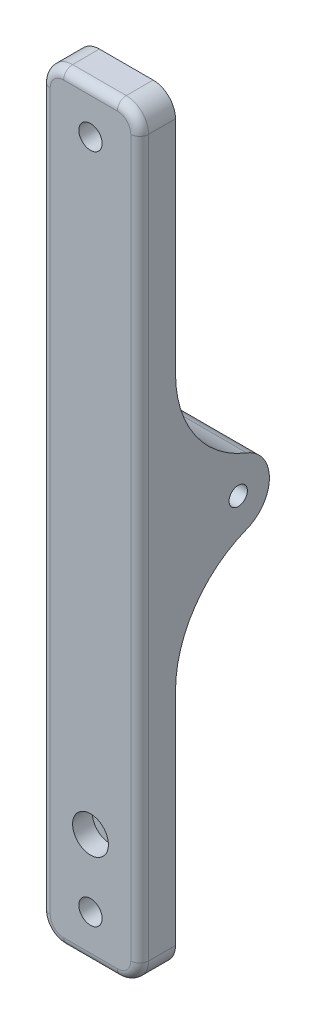
ISO-10303-21;
HEADER;
FILE_DESCRIPTION(('STEP AP214'),'2;1');
FILE_NAME('part.step','',(''),(''),'','','');
FILE_SCHEMA(('AUTOMOTIVE_DESIGN { 1 0 10303 214 1 1 1 1 }'));
ENDSEC;
DATA;
#1=APPLICATION_CONTEXT('core data for automotive mechanical design processes');
#2=APPLICATION_PROTOCOL_DEFINITION('international standard','automotive_design',2000,#1);
#3=PRODUCT_CONTEXT('',#1,'mechanical');
#4=PRODUCT('Part','Part','',(#3));
#5=PRODUCT_RELATED_PRODUCT_CATEGORY('part','',(#4));
#6=PRODUCT_DEFINITION_FORMATION('','',#4);
#7=PRODUCT_DEFINITION_CONTEXT('part definition',#1,'design');
#8=PRODUCT_DEFINITION('design','',#6,#7);
#9=PRODUCT_DEFINITION_SHAPE('','',#8);
#10=(LENGTH_UNIT() NAMED_UNIT(*) SI_UNIT(.MILLI.,.METRE.));
#11=(NAMED_UNIT(*) PLANE_ANGLE_UNIT() SI_UNIT($,.RADIAN.));
#12=(NAMED_UNIT(*) SI_UNIT($,.STERADIAN.) SOLID_ANGLE_UNIT());
#13=UNCERTAINTY_MEASURE_WITH_UNIT(LENGTH_MEASURE(1.E-05),#10,'distance_accuracy_value','');
#14=(GEOMETRIC_REPRESENTATION_CONTEXT(3) GLOBAL_UNCERTAINTY_ASSIGNED_CONTEXT((#13)) GLOBAL_UNIT_ASSIGNED_CONTEXT((#10,
#11,#12)) REPRESENTATION_CONTEXT('',''));
#15=CARTESIAN_POINT('',(0.,0.,0.));
#16=DIRECTION('',(0.,0.,1.));
#17=DIRECTION('',(1.,0.,0.));
#18=AXIS2_PLACEMENT_3D('',#15,#16,#17);
#19=CARTESIAN_POINT('',(11.,-85.,14.5));
#20=DIRECTION('',(-1.,0.,0.));
#21=DIRECTION('',(0.,0.,1.));
#22=AXIS2_PLACEMENT_3D('',#19,#20,#21);
#23=PLANE('',#22);
#24=CARTESIAN_POINT('',(11.,0.,-7.51700000000001));
#25=DIRECTION('',(1.,0.,0.));
#26=DIRECTION('',(0.,0.,-1.));
#27=AXIS2_PLACEMENT_3D('',#24,#25,#26);
#28=CIRCLE('',#27,2.05);
#29=CARTESIAN_POINT('',(11.,0.,-9.56700000000001));
#30=VERTEX_POINT('',#29);
#31=EDGE_CURVE('E665',#30,#30,#28,.T.);
#32=ORIENTED_EDGE('',*,*,#31,.F.);
#33=EDGE_LOOP('',(#32));
#34=FACE_BOUND('',#33,.T.);
#35=CARTESIAN_POINT('',(11.,-30.6779253585061,-18.5));
#36=DIRECTION('',(-1.,0.,0.));
#37=DIRECTION('',(0.,0.,1.));
#38=AXIS2_PLACEMENT_3D('',#35,#36,#37);
#39=CIRCLE('',#38,25.);
#40=CARTESIAN_POINT('',(11.,-30.6779253585062,6.49999999999999));
#41=VERTEX_POINT('',#40);
#42=CARTESIAN_POINT('',(11.,-7.38940089041614,-9.40909090909091));
#43=VERTEX_POINT('',#42);
#44=EDGE_CURVE('E160',#41,#43,#39,.T.);
#45=ORIENTED_EDGE('',*,*,#44,.T.);
#46=CARTESIAN_POINT('',(11.,0.0629269393726574,-6.5));
#47=DIRECTION('',(-1.,0.,0.));
#48=DIRECTION('',(0.,0.,1.));
#49=AXIS2_PLACEMENT_3D('',#46,#47,#48);
#50=CIRCLE('',#49,8.);
#51=CARTESIAN_POINT('',(11.,0.,-14.4997525086906));
#52=VERTEX_POINT('',#51);
#53=EDGE_CURVE('E283',#43,#52,#50,.F.);
#54=ORIENTED_EDGE('',*,*,#53,.T.);
#55=CARTESIAN_POINT('',(11.,-0.0629269393726574,-6.5));
#56=DIRECTION('',(-1.,0.,0.));
#57=DIRECTION('',(0.,0.,1.));
#58=AXIS2_PLACEMENT_3D('',#55,#56,#57);
#59=CIRCLE('',#58,8.);
#60=CARTESIAN_POINT('',(11.,7.38940089041614,-9.40909090909091));
#61=VERTEX_POINT('',#60);
#62=EDGE_CURVE('E281',#52,#61,#59,.F.);
#63=ORIENTED_EDGE('',*,*,#62,.T.);
#64=CARTESIAN_POINT('',(11.,30.6779253585061,-18.5));
#65=DIRECTION('',(-1.,0.,0.));
#66=DIRECTION('',(0.,0.,1.));
#67=AXIS2_PLACEMENT_3D('',#64,#65,#66);
#68=CIRCLE('',#67,25.);
#69=CARTESIAN_POINT('',(11.,30.6779253585062,6.49999999999999));
#70=VERTEX_POINT('',#69);
#71=EDGE_CURVE('E193',#61,#70,#68,.T.);
#72=ORIENTED_EDGE('',*,*,#71,.T.);
#73=DIRECTION('',(0.,-1.,0.));
#74=VECTOR('',#73,1.);
#75=CARTESIAN_POINT('',(11.,85.,6.5));
#76=LINE('',#75,#74);
#77=CARTESIAN_POINT('',(11.,80.,6.5));
#78=VERTEX_POINT('',#77);
#79=EDGE_CURVE('E304',#78,#70,#76,.T.);
#80=ORIENTED_EDGE('',*,*,#79,.F.);
#81=DIRECTION('',(0.,0.,-1.));
#82=VECTOR('',#81,1.);
#83=CARTESIAN_POINT('',(11.,80.,14.5));
#84=LINE('',#83,#82);
#85=CARTESIAN_POINT('',(11.,80.,12.5));
#86=VERTEX_POINT('',#85);
#87=EDGE_CURVE('E197',#78,#86,#84,.F.);
#88=ORIENTED_EDGE('',*,*,#87,.T.);
#89=DIRECTION('',(0.,1.,0.));
#90=VECTOR('',#89,1.);
#91=CARTESIAN_POINT('',(11.,-85.,12.5));
#92=LINE('',#91,#90);
#93=CARTESIAN_POINT('',(11.,-80.,12.5));
#94=VERTEX_POINT('',#93);
#95=EDGE_CURVE('E252',#86,#94,#92,.F.);
#96=ORIENTED_EDGE('',*,*,#95,.T.);
#97=DIRECTION('',(0.,0.,-1.));
#98=VECTOR('',#97,1.);
#99=CARTESIAN_POINT('',(11.,-80.,14.5));
#100=LINE('',#99,#98);
#101=CARTESIAN_POINT('',(11.,-80.,6.5));
#102=VERTEX_POINT('',#101);
#103=EDGE_CURVE('E162',#94,#102,#100,.T.);
#104=ORIENTED_EDGE('',*,*,#103,.T.);
#105=DIRECTION('',(0.,1.,0.));
#106=VECTOR('',#105,1.);
#107=CARTESIAN_POINT('',(11.,-85.,6.5));
#108=LINE('',#107,#106);
#109=EDGE_CURVE('E158',#102,#41,#108,.T.);
#110=ORIENTED_EDGE('',*,*,#109,.T.);
#111=EDGE_LOOP('',(#45,#54,#63,#72,#80,#88,#96,#104,#110));
#112=FACE_BOUND('',#111,.T.);
#113=ADVANCED_FACE('F37',(#34,#112),#23,.F.);
#114=CARTESIAN_POINT('',(-11.,-85.,14.5));
#115=DIRECTION('',(1.,0.,0.));
#116=DIRECTION('',(0.,0.,-1.));
#117=AXIS2_PLACEMENT_3D('',#114,#115,#116);
#118=PLANE('',#117);
#119=CARTESIAN_POINT('',(-11.,0.,-7.51700000000001));
#120=DIRECTION('',(1.,0.,0.));
#121=DIRECTION('',(0.,0.,-1.));
#122=AXIS2_PLACEMENT_3D('',#119,#120,#121);
#123=CIRCLE('',#122,2.05);
#124=CARTESIAN_POINT('',(-11.,0.,-9.56700000000001));
#125=VERTEX_POINT('',#124);
#126=EDGE_CURVE('E664',#125,#125,#123,.T.);
#127=ORIENTED_EDGE('',*,*,#126,.T.);
#128=EDGE_LOOP('',(#127));
#129=FACE_BOUND('',#128,.T.);
#130=CARTESIAN_POINT('',(-11.,-0.0629269393726574,-6.5));
#131=DIRECTION('',(1.,0.,0.));
#132=DIRECTION('',(0.,0.,-1.));
#133=AXIS2_PLACEMENT_3D('',#130,#131,#132);
#134=CIRCLE('',#133,8.);
#135=CARTESIAN_POINT('',(-11.,7.38940089041614,-9.40909090909091));
#136=VERTEX_POINT('',#135);
#137=CARTESIAN_POINT('',(-11.,0.,-14.4997525086906));
#138=VERTEX_POINT('',#137);
#139=EDGE_CURVE('E54',#136,#138,#134,.F.);
#140=ORIENTED_EDGE('',*,*,#139,.T.);
#141=CARTESIAN_POINT('',(-11.,0.0629269393726574,-6.5));
#142=DIRECTION('',(1.,0.,0.));
#143=DIRECTION('',(0.,0.,-1.));
#144=AXIS2_PLACEMENT_3D('',#141,#142,#143);
#145=CIRCLE('',#144,8.);
#146=CARTESIAN_POINT('',(-11.,-7.38940089041614,-9.40909090909091));
#147=VERTEX_POINT('',#146);
#148=EDGE_CURVE('E46',#138,#147,#145,.F.);
#149=ORIENTED_EDGE('',*,*,#148,.T.);
#150=CARTESIAN_POINT('',(-11.,-30.6779253585061,-18.5));
#151=DIRECTION('',(1.,0.,0.));
#152=DIRECTION('',(0.,0.,-1.));
#153=AXIS2_PLACEMENT_3D('',#150,#151,#152);
#154=CIRCLE('',#153,25.);
#155=CARTESIAN_POINT('',(-11.,-30.6779253585062,6.49999999999999));
#156=VERTEX_POINT('',#155);
#157=EDGE_CURVE('E177',#147,#156,#154,.T.);
#158=ORIENTED_EDGE('',*,*,#157,.T.);
#159=DIRECTION('',(0.,1.,0.));
#160=VECTOR('',#159,1.);
#161=CARTESIAN_POINT('',(-11.,-85.,6.5));
#162=LINE('',#161,#160);
#163=CARTESIAN_POINT('',(-11.,-80.,6.5));
#164=VERTEX_POINT('',#163);
#165=EDGE_CURVE('E166',#164,#156,#162,.T.);
#166=ORIENTED_EDGE('',*,*,#165,.F.);
#167=DIRECTION('',(0.,0.,-1.));
#168=VECTOR('',#167,1.);
#169=CARTESIAN_POINT('',(-11.,-80.,14.5));
#170=LINE('',#169,#168);
#171=CARTESIAN_POINT('',(-11.,-80.,12.5));
#172=VERTEX_POINT('',#171);
#173=EDGE_CURVE('E212',#164,#172,#170,.F.);
#174=ORIENTED_EDGE('',*,*,#173,.T.);
#175=DIRECTION('',(0.,-1.,0.));
#176=VECTOR('',#175,1.);
#177=CARTESIAN_POINT('',(-11.,-85.,12.5));
#178=LINE('',#177,#176);
#179=CARTESIAN_POINT('',(-11.,79.9999999999999,12.5));
#180=VERTEX_POINT('',#179);
#181=EDGE_CURVE('E244',#172,#180,#178,.F.);
#182=ORIENTED_EDGE('',*,*,#181,.T.);
#183=DIRECTION('',(0.,0.,-1.));
#184=VECTOR('',#183,1.);
#185=CARTESIAN_POINT('',(-11.,79.9999999999999,14.5));
#186=LINE('',#185,#184);
#187=CARTESIAN_POINT('',(-11.,79.9999999999999,6.5));
#188=VERTEX_POINT('',#187);
#189=EDGE_CURVE('E210',#180,#188,#186,.T.);
#190=ORIENTED_EDGE('',*,*,#189,.T.);
#191=DIRECTION('',(0.,-1.,0.));
#192=VECTOR('',#191,1.);
#193=CARTESIAN_POINT('',(-11.,85.,6.5));
#194=LINE('',#193,#192);
#195=CARTESIAN_POINT('',(-11.,30.6779253585062,6.49999999999999));
#196=VERTEX_POINT('',#195);
#197=EDGE_CURVE('E188',#188,#196,#194,.T.);
#198=ORIENTED_EDGE('',*,*,#197,.T.);
#199=CARTESIAN_POINT('',(-11.,30.6779253585061,-18.5));
#200=DIRECTION('',(1.,0.,0.));
#201=DIRECTION('',(0.,0.,-1.));
#202=AXIS2_PLACEMENT_3D('',#199,#200,#201);
#203=CIRCLE('',#202,25.);
#204=EDGE_CURVE('E195',#196,#136,#203,.T.);
#205=ORIENTED_EDGE('',*,*,#204,.T.);
#206=EDGE_LOOP('',(#140,#149,#158,#166,#174,#182,#190,#198,#205));
#207=FACE_BOUND('',#206,.T.);
#208=ADVANCED_FACE('F314',(#129,#207),#118,.F.);
#209=CARTESIAN_POINT('',(-11.,-85.,14.5));
#210=DIRECTION('',(0.,1.,0.));
#211=DIRECTION('',(0.,0.,1.));
#212=AXIS2_PLACEMENT_3D('',#209,#210,#211);
#213=PLANE('',#212);
#214=DIRECTION('',(0.,0.,-1.));
#215=VECTOR('',#214,1.);
#216=CARTESIAN_POINT('',(6.,-85.,14.5));
#217=LINE('',#216,#215);
#218=CARTESIAN_POINT('',(6.,-85.,6.5));
#219=VERTEX_POINT('',#218);
#220=CARTESIAN_POINT('',(6.,-85.,12.5));
#221=VERTEX_POINT('',#220);
#222=EDGE_CURVE('E207',#219,#221,#217,.F.);
#223=ORIENTED_EDGE('',*,*,#222,.T.);
#224=DIRECTION('',(1.,0.,0.));
#225=VECTOR('',#224,1.);
#226=CARTESIAN_POINT('',(-11.,-85.,12.5));
#227=LINE('',#226,#225);
#228=CARTESIAN_POINT('',(-6.,-85.,12.5));
#229=VERTEX_POINT('',#228);
#230=EDGE_CURVE('E256',#221,#229,#227,.F.);
#231=ORIENTED_EDGE('',*,*,#230,.T.);
#232=DIRECTION('',(0.,0.,-1.));
#233=VECTOR('',#232,1.);
#234=CARTESIAN_POINT('',(-6.,-85.,14.5));
#235=LINE('',#234,#233);
#236=CARTESIAN_POINT('',(-6.,-85.,6.5));
#237=VERTEX_POINT('',#236);
#238=EDGE_CURVE('E205',#229,#237,#235,.T.);
#239=ORIENTED_EDGE('',*,*,#238,.T.);
#240=DIRECTION('',(1.,0.,0.));
#241=VECTOR('',#240,1.);
#242=CARTESIAN_POINT('',(-11.,-85.,6.5));
#243=LINE('',#242,#241);
#244=EDGE_CURVE('E300',#237,#219,#243,.T.);
#245=ORIENTED_EDGE('',*,*,#244,.T.);
#246=EDGE_LOOP('',(#223,#231,#239,#245));
#247=FACE_BOUND('',#246,.T.);
#248=ADVANCED_FACE('F379',(#247),#213,.F.);
#249=CARTESIAN_POINT('',(-11.,85.,14.5));
#250=DIRECTION('',(0.,-1.,0.));
#251=DIRECTION('',(0.,0.,-1.));
#252=AXIS2_PLACEMENT_3D('',#249,#250,#251);
#253=PLANE('',#252);
#254=DIRECTION('',(0.,0.,-1.));
#255=VECTOR('',#254,1.);
#256=CARTESIAN_POINT('',(-6.,85.,14.5));
#257=LINE('',#256,#255);
#258=CARTESIAN_POINT('',(-6.,85.,6.5));
#259=VERTEX_POINT('',#258);
#260=CARTESIAN_POINT('',(-6.,85.,12.5));
#261=VERTEX_POINT('',#260);
#262=EDGE_CURVE('E221',#259,#261,#257,.F.);
#263=ORIENTED_EDGE('',*,*,#262,.T.);
#264=DIRECTION('',(-1.,0.,0.));
#265=VECTOR('',#264,1.);
#266=CARTESIAN_POINT('',(-11.,85.,12.5));
#267=LINE('',#266,#265);
#268=CARTESIAN_POINT('',(5.99999999999999,85.,12.5));
#269=VERTEX_POINT('',#268);
#270=EDGE_CURVE('E248',#261,#269,#267,.F.);
#271=ORIENTED_EDGE('',*,*,#270,.T.);
#272=DIRECTION('',(0.,0.,-1.));
#273=VECTOR('',#272,1.);
#274=CARTESIAN_POINT('',(5.99999999999999,85.,14.5));
#275=LINE('',#274,#273);
#276=CARTESIAN_POINT('',(5.99999999999999,85.,6.5));
#277=VERTEX_POINT('',#276);
#278=EDGE_CURVE('E219',#269,#277,#275,.T.);
#279=ORIENTED_EDGE('',*,*,#278,.T.);
#280=DIRECTION('',(1.,0.,0.));
#281=VECTOR('',#280,1.);
#282=CARTESIAN_POINT('',(-11.,85.,6.5));
#283=LINE('',#282,#281);
#284=EDGE_CURVE('E183',#259,#277,#283,.T.);
#285=ORIENTED_EDGE('',*,*,#284,.F.);
#286=EDGE_LOOP('',(#263,#271,#279,#285));
#287=FACE_BOUND('',#286,.T.);
#288=ADVANCED_FACE('F360',(#287),#253,.F.);
#289=CARTESIAN_POINT('',(0.,0.,14.5));
#290=DIRECTION('',(0.,0.,-1.));
#291=DIRECTION('',(-1.,0.,0.));
#292=AXIS2_PLACEMENT_3D('',#289,#290,#291);
#293=PLANE('',#292);
#294=CARTESIAN_POINT('',(0.,-60.0028,14.5));
#295=DIRECTION('',(0.,0.,1.));
#296=DIRECTION('',(1.,0.,0.));
#297=AXIS2_PLACEMENT_3D('',#294,#295,#296);
#298=CIRCLE('',#297,3.99999999999999);
#299=CARTESIAN_POINT('',(3.99999999999999,-60.0028,14.5));
#300=VERTEX_POINT('',#299);
#301=EDGE_CURVE('E645',#300,#300,#298,.T.);
#302=ORIENTED_EDGE('',*,*,#301,.F.);
#303=EDGE_LOOP('',(#302));
#304=FACE_BOUND('',#303,.T.);
#305=CARTESIAN_POINT('',(0.,-75.,14.5));
#306=DIRECTION('',(0.,0.,1.));
#307=DIRECTION('',(1.,0.,0.));
#308=AXIS2_PLACEMENT_3D('',#305,#306,#307);
#309=CIRCLE('',#308,2.6);
#310=CARTESIAN_POINT('',(2.6,-75.,14.5));
#311=VERTEX_POINT('',#310);
#312=EDGE_CURVE('E649',#311,#311,#309,.T.);
#313=ORIENTED_EDGE('',*,*,#312,.F.);
#314=EDGE_LOOP('',(#313));
#315=FACE_BOUND('',#314,.T.);
#316=CARTESIAN_POINT('',(0.,75.,14.5));
#317=DIRECTION('',(0.,0.,1.));
#318=DIRECTION('',(1.,0.,0.));
#319=AXIS2_PLACEMENT_3D('',#316,#317,#318);
#320=CIRCLE('',#319,2.6);
#321=CARTESIAN_POINT('',(2.6,75.,14.5));
#322=VERTEX_POINT('',#321);
#323=EDGE_CURVE('E291',#322,#322,#320,.T.);
#324=ORIENTED_EDGE('',*,*,#323,.F.);
#325=EDGE_LOOP('',(#324));
#326=FACE_BOUND('',#325,.T.);
#327=DIRECTION('',(0.,-1.,0.));
#328=VECTOR('',#327,1.);
#329=CARTESIAN_POINT('',(-9.,0.,14.5));
#330=LINE('',#329,#328);
#331=CARTESIAN_POINT('',(-9.,79.9999999999999,14.5));
#332=VERTEX_POINT('',#331);
#333=CARTESIAN_POINT('',(-9.,-80.,14.5));
#334=VERTEX_POINT('',#333);
#335=EDGE_CURVE('E236',#332,#334,#330,.T.);
#336=ORIENTED_EDGE('',*,*,#335,.T.);
#337=CARTESIAN_POINT('',(-6.,-80.,14.5));
#338=DIRECTION('',(0.,0.,-1.));
#339=DIRECTION('',(-1.,0.,0.));
#340=AXIS2_PLACEMENT_3D('',#337,#338,#339);
#341=CIRCLE('',#340,3.);
#342=CARTESIAN_POINT('',(-6.,-83.,14.5));
#343=VERTEX_POINT('',#342);
#344=EDGE_CURVE('E238',#334,#343,#341,.F.);
#345=ORIENTED_EDGE('',*,*,#344,.T.);
#346=DIRECTION('',(1.,0.,0.));
#347=VECTOR('',#346,1.);
#348=CARTESIAN_POINT('',(0.,-83.,14.5));
#349=LINE('',#348,#347);
#350=CARTESIAN_POINT('',(6.,-83.,14.5));
#351=VERTEX_POINT('',#350);
#352=EDGE_CURVE('E224',#343,#351,#349,.T.);
#353=ORIENTED_EDGE('',*,*,#352,.T.);
#354=CARTESIAN_POINT('',(6.,-80.,14.5));
#355=DIRECTION('',(0.,0.,-1.));
#356=DIRECTION('',(-1.,0.,0.));
#357=AXIS2_PLACEMENT_3D('',#354,#355,#356);
#358=CIRCLE('',#357,3.);
#359=CARTESIAN_POINT('',(9.,-80.,14.5));
#360=VERTEX_POINT('',#359);
#361=EDGE_CURVE('E226',#351,#360,#358,.F.);
#362=ORIENTED_EDGE('',*,*,#361,.T.);
#363=DIRECTION('',(0.,1.,0.));
#364=VECTOR('',#363,1.);
#365=CARTESIAN_POINT('',(9.,0.,14.5));
#366=LINE('',#365,#364);
#367=CARTESIAN_POINT('',(9.,80.,14.5));
#368=VERTEX_POINT('',#367);
#369=EDGE_CURVE('E228',#360,#368,#366,.T.);
#370=ORIENTED_EDGE('',*,*,#369,.T.);
#371=CARTESIAN_POINT('',(5.99999999999999,80.,14.5));
#372=DIRECTION('',(0.,0.,-1.));
#373=DIRECTION('',(-1.,0.,0.));
#374=AXIS2_PLACEMENT_3D('',#371,#372,#373);
#375=CIRCLE('',#374,3.);
#376=CARTESIAN_POINT('',(5.99999999999999,83.,14.5));
#377=VERTEX_POINT('',#376);
#378=EDGE_CURVE('E230',#368,#377,#375,.F.);
#379=ORIENTED_EDGE('',*,*,#378,.T.);
#380=DIRECTION('',(-1.,0.,0.));
#381=VECTOR('',#380,1.);
#382=CARTESIAN_POINT('',(0.,83.,14.5));
#383=LINE('',#382,#381);
#384=CARTESIAN_POINT('',(-6.,83.,14.5));
#385=VERTEX_POINT('',#384);
#386=EDGE_CURVE('E232',#377,#385,#383,.T.);
#387=ORIENTED_EDGE('',*,*,#386,.T.);
#388=CARTESIAN_POINT('',(-6.,79.9999999999999,14.5));
#389=DIRECTION('',(0.,0.,-1.));
#390=DIRECTION('',(-1.,0.,0.));
#391=AXIS2_PLACEMENT_3D('',#388,#389,#390);
#392=CIRCLE('',#391,3.);
#393=EDGE_CURVE('E234',#385,#332,#392,.F.);
#394=ORIENTED_EDGE('',*,*,#393,.T.);
#395=EDGE_LOOP('',(#336,#345,#353,#362,#370,#379,#387,#394));
#396=FACE_BOUND('',#395,.T.);
#397=ADVANCED_FACE('F338',(#304,#315,#326,#396),#293,.F.);
#398=CARTESIAN_POINT('',(-11.,85.,6.5));
#399=DIRECTION('',(0.,0.,1.));
#400=DIRECTION('',(0.,-1.,0.));
#401=AXIS2_PLACEMENT_3D('',#398,#399,#400);
#402=PLANE('',#401);
#403=CARTESIAN_POINT('',(0.,75.,6.5));
#404=DIRECTION('',(0.,0.,1.));
#405=DIRECTION('',(0.,-1.,0.));
#406=AXIS2_PLACEMENT_3D('',#403,#404,#405);
#407=CIRCLE('',#406,2.6);
#408=CARTESIAN_POINT('',(0.,72.4,6.5));
#409=VERTEX_POINT('',#408);
#410=EDGE_CURVE('E287',#409,#409,#407,.T.);
#411=ORIENTED_EDGE('',*,*,#410,.T.);
#412=EDGE_LOOP('',(#411));
#413=FACE_BOUND('',#412,.T.);
#414=ORIENTED_EDGE('',*,*,#197,.F.);
#415=CARTESIAN_POINT('',(-6.,79.9999999999999,6.5));
#416=DIRECTION('',(0.,0.,1.));
#417=DIRECTION('',(0.,-1.,0.));
#418=AXIS2_PLACEMENT_3D('',#415,#416,#417);
#419=CIRCLE('',#418,5.);
#420=EDGE_CURVE('E217',#188,#259,#419,.F.);
#421=ORIENTED_EDGE('',*,*,#420,.T.);
#422=ORIENTED_EDGE('',*,*,#284,.T.);
#423=CARTESIAN_POINT('',(5.99999999999999,80.,6.5));
#424=DIRECTION('',(0.,0.,1.));
#425=DIRECTION('',(0.,-1.,0.));
#426=AXIS2_PLACEMENT_3D('',#423,#424,#425);
#427=CIRCLE('',#426,5.);
#428=EDGE_CURVE('E215',#277,#78,#427,.F.);
#429=ORIENTED_EDGE('',*,*,#428,.T.);
#430=ORIENTED_EDGE('',*,*,#79,.T.);
#431=DIRECTION('',(-1.,0.,0.));
#432=VECTOR('',#431,1.);
#433=CARTESIAN_POINT('',(-11.,30.6779253585061,6.49999999999999));
#434=LINE('',#433,#432);
#435=EDGE_CURVE('E178',#70,#196,#434,.T.);
#436=ORIENTED_EDGE('',*,*,#435,.T.);
#437=EDGE_LOOP('',(#414,#421,#422,#429,#430,#436));
#438=FACE_BOUND('',#437,.T.);
#439=ADVANCED_FACE('F310',(#413,#438),#402,.F.);
#440=CARTESIAN_POINT('',(-11.,-85.,6.5));
#441=DIRECTION('',(0.,0.,-1.));
#442=DIRECTION('',(0.,1.,0.));
#443=AXIS2_PLACEMENT_3D('',#440,#441,#442);
#444=PLANE('',#443);
#445=CARTESIAN_POINT('',(0.,-60.0028,6.5));
#446=DIRECTION('',(0.,0.,-1.));
#447=DIRECTION('',(0.,1.,0.));
#448=AXIS2_PLACEMENT_3D('',#445,#446,#447);
#449=CIRCLE('',#448,2.25);
#450=CARTESIAN_POINT('',(0.,-57.7528,6.5));
#451=VERTEX_POINT('',#450);
#452=EDGE_CURVE('E41',#451,#451,#449,.T.);
#453=ORIENTED_EDGE('',*,*,#452,.F.);
#454=EDGE_LOOP('',(#453));
#455=FACE_BOUND('',#454,.T.);
#456=CARTESIAN_POINT('',(0.,-75.,6.5));
#457=DIRECTION('',(0.,0.,-1.));
#458=DIRECTION('',(0.,1.,0.));
#459=AXIS2_PLACEMENT_3D('',#456,#457,#458);
#460=CIRCLE('',#459,2.6);
#461=CARTESIAN_POINT('',(0.,-72.4,6.5));
#462=VERTEX_POINT('',#461);
#463=EDGE_CURVE('E296',#462,#462,#460,.T.);
#464=ORIENTED_EDGE('',*,*,#463,.F.);
#465=EDGE_LOOP('',(#464));
#466=FACE_BOUND('',#465,.T.);
#467=ORIENTED_EDGE('',*,*,#109,.F.);
#468=CARTESIAN_POINT('',(6.,-80.,6.5));
#469=DIRECTION('',(0.,0.,-1.));
#470=DIRECTION('',(0.,1.,0.));
#471=AXIS2_PLACEMENT_3D('',#468,#469,#470);
#472=CIRCLE('',#471,5.);
#473=EDGE_CURVE('E203',#102,#219,#472,.T.);
#474=ORIENTED_EDGE('',*,*,#473,.T.);
#475=ORIENTED_EDGE('',*,*,#244,.F.);
#476=CARTESIAN_POINT('',(-6.,-80.,6.5));
#477=DIRECTION('',(0.,0.,-1.));
#478=DIRECTION('',(0.,1.,0.));
#479=AXIS2_PLACEMENT_3D('',#476,#477,#478);
#480=CIRCLE('',#479,5.);
#481=EDGE_CURVE('E201',#237,#164,#480,.T.);
#482=ORIENTED_EDGE('',*,*,#481,.T.);
#483=ORIENTED_EDGE('',*,*,#165,.T.);
#484=DIRECTION('',(1.,0.,0.));
#485=VECTOR('',#484,1.);
#486=CARTESIAN_POINT('',(11.,-30.6779253585061,6.49999999999999));
#487=LINE('',#486,#485);
#488=EDGE_CURVE('E174',#156,#41,#487,.T.);
#489=ORIENTED_EDGE('',*,*,#488,.T.);
#490=EDGE_LOOP('',(#467,#474,#475,#482,#483,#489));
#491=FACE_BOUND('',#490,.T.);
#492=ADVANCED_FACE('F181',(#455,#466,#491),#444,.T.);
#493=CARTESIAN_POINT('',(-11.,-30.6779253585061,-18.5));
#494=DIRECTION('',(-1.,0.,0.));
#495=DIRECTION('',(0.,0.,1.));
#496=AXIS2_PLACEMENT_3D('',#493,#494,#495);
#497=CYLINDRICAL_SURFACE('',#496,25.);
#498=ORIENTED_EDGE('',*,*,#157,.F.);
#499=DIRECTION('',(-1.,0.,0.));
#500=VECTOR('',#499,1.);
#501=CARTESIAN_POINT('',(-11.,-7.38940089041614,-9.40909090909091));
#502=LINE('',#501,#500);
#503=EDGE_CURVE('E176',#147,#43,#502,.F.);
#504=ORIENTED_EDGE('',*,*,#503,.T.);
#505=ORIENTED_EDGE('',*,*,#44,.F.);
#506=ORIENTED_EDGE('',*,*,#488,.F.);
#507=EDGE_LOOP('',(#498,#504,#505,#506));
#508=FACE_BOUND('',#507,.T.);
#509=ADVANCED_FACE('F173',(#508),#497,.F.);
#510=CARTESIAN_POINT('',(-11.,30.6779253585061,-18.5));
#511=DIRECTION('',(-1.,0.,0.));
#512=DIRECTION('',(0.,0.,1.));
#513=AXIS2_PLACEMENT_3D('',#510,#511,#512);
#514=CYLINDRICAL_SURFACE('',#513,25.);
#515=ORIENTED_EDGE('',*,*,#71,.F.);
#516=DIRECTION('',(-1.,0.,0.));
#517=VECTOR('',#516,1.);
#518=CARTESIAN_POINT('',(-11.,7.38940089041614,-9.40909090909091));
#519=LINE('',#518,#517);
#520=EDGE_CURVE('E11',#61,#136,#519,.T.);
#521=ORIENTED_EDGE('',*,*,#520,.T.);
#522=ORIENTED_EDGE('',*,*,#204,.F.);
#523=ORIENTED_EDGE('',*,*,#435,.F.);
#524=EDGE_LOOP('',(#515,#521,#522,#523));
#525=FACE_BOUND('',#524,.T.);
#526=ADVANCED_FACE('F313',(#525),#514,.F.);
#527=CARTESIAN_POINT('',(6.,-80.,14.5));
#528=DIRECTION('',(0.,0.,-1.));
#529=DIRECTION('',(-1.,0.,0.));
#530=AXIS2_PLACEMENT_3D('',#527,#528,#529);
#531=CYLINDRICAL_SURFACE('',#530,5.);
#532=ORIENTED_EDGE('',*,*,#103,.F.);
#533=CARTESIAN_POINT('',(6.,-80.,12.5));
#534=DIRECTION('',(0.,0.,-1.));
#535=DIRECTION('',(-1.,0.,0.));
#536=AXIS2_PLACEMENT_3D('',#533,#534,#535);
#537=CIRCLE('',#536,5.);
#538=EDGE_CURVE('E254',#94,#221,#537,.T.);
#539=ORIENTED_EDGE('',*,*,#538,.T.);
#540=ORIENTED_EDGE('',*,*,#222,.F.);
#541=ORIENTED_EDGE('',*,*,#473,.F.);
#542=EDGE_LOOP('',(#532,#539,#540,#541));
#543=FACE_BOUND('',#542,.T.);
#544=ADVANCED_FACE('F376',(#543),#531,.T.);
#545=CARTESIAN_POINT('',(-6.,-80.,14.5));
#546=DIRECTION('',(0.,0.,-1.));
#547=DIRECTION('',(-1.,0.,0.));
#548=AXIS2_PLACEMENT_3D('',#545,#546,#547);
#549=CYLINDRICAL_SURFACE('',#548,5.);
#550=ORIENTED_EDGE('',*,*,#238,.F.);
#551=CARTESIAN_POINT('',(-6.,-80.,12.5));
#552=DIRECTION('',(0.,0.,-1.));
#553=DIRECTION('',(-1.,0.,0.));
#554=AXIS2_PLACEMENT_3D('',#551,#552,#553);
#555=CIRCLE('',#554,5.);
#556=EDGE_CURVE('E241',#229,#172,#555,.T.);
#557=ORIENTED_EDGE('',*,*,#556,.T.);
#558=ORIENTED_EDGE('',*,*,#173,.F.);
#559=ORIENTED_EDGE('',*,*,#481,.F.);
#560=EDGE_LOOP('',(#550,#557,#558,#559));
#561=FACE_BOUND('',#560,.T.);
#562=ADVANCED_FACE('F322',(#561),#549,.T.);
#563=CARTESIAN_POINT('',(-6.,79.9999999999999,14.5));
#564=DIRECTION('',(0.,0.,-1.));
#565=DIRECTION('',(-1.,0.,0.));
#566=AXIS2_PLACEMENT_3D('',#563,#564,#565);
#567=CYLINDRICAL_SURFACE('',#566,5.);
#568=ORIENTED_EDGE('',*,*,#189,.F.);
#569=CARTESIAN_POINT('',(-6.,79.9999999999999,12.5));
#570=DIRECTION('',(0.,0.,-1.));
#571=DIRECTION('',(-1.,0.,0.));
#572=AXIS2_PLACEMENT_3D('',#569,#570,#571);
#573=CIRCLE('',#572,5.);
#574=EDGE_CURVE('E246',#180,#261,#573,.T.);
#575=ORIENTED_EDGE('',*,*,#574,.T.);
#576=ORIENTED_EDGE('',*,*,#262,.F.);
#577=ORIENTED_EDGE('',*,*,#420,.F.);
#578=EDGE_LOOP('',(#568,#575,#576,#577));
#579=FACE_BOUND('',#578,.T.);
#580=ADVANCED_FACE('F348',(#579),#567,.T.);
#581=CARTESIAN_POINT('',(5.99999999999999,80.,14.5));
#582=DIRECTION('',(0.,0.,-1.));
#583=DIRECTION('',(-1.,0.,0.));
#584=AXIS2_PLACEMENT_3D('',#581,#582,#583);
#585=CYLINDRICAL_SURFACE('',#584,5.);
#586=ORIENTED_EDGE('',*,*,#278,.F.);
#587=CARTESIAN_POINT('',(5.99999999999999,80.,12.5));
#588=DIRECTION('',(0.,0.,-1.));
#589=DIRECTION('',(-1.,0.,0.));
#590=AXIS2_PLACEMENT_3D('',#587,#588,#589);
#591=CIRCLE('',#590,5.);
#592=EDGE_CURVE('E250',#269,#86,#591,.T.);
#593=ORIENTED_EDGE('',*,*,#592,.T.);
#594=ORIENTED_EDGE('',*,*,#87,.F.);
#595=ORIENTED_EDGE('',*,*,#428,.F.);
#596=EDGE_LOOP('',(#586,#593,#594,#595));
#597=FACE_BOUND('',#596,.T.);
#598=ADVANCED_FACE('F364',(#597),#585,.T.);
#599=CARTESIAN_POINT('',(5.99999999999999,80.,12.5));
#600=DIRECTION('',(0.,0.,-1.));
#601=DIRECTION('',(-1.,0.,0.));
#602=AXIS2_PLACEMENT_3D('',#599,#600,#601);
#603=TOROIDAL_SURFACE('',#602,3.,2.);
#604=CARTESIAN_POINT('',(9.,80.,12.5));
#605=DIRECTION('',(0.,-1.,0.));
#606=DIRECTION('',(0.,0.,-1.));
#607=AXIS2_PLACEMENT_3D('',#604,#605,#606);
#608=CIRCLE('',#607,2.);
#609=EDGE_CURVE('E275',#86,#368,#608,.T.);
#610=ORIENTED_EDGE('',*,*,#609,.F.);
#611=ORIENTED_EDGE('',*,*,#592,.F.);
#612=CARTESIAN_POINT('',(5.99999999999999,83.,12.5));
#613=DIRECTION('',(-1.,0.,0.));
#614=DIRECTION('',(0.,0.,1.));
#615=AXIS2_PLACEMENT_3D('',#612,#613,#614);
#616=CIRCLE('',#615,2.);
#617=EDGE_CURVE('E167',#377,#269,#616,.T.);
#618=ORIENTED_EDGE('',*,*,#617,.F.);
#619=ORIENTED_EDGE('',*,*,#378,.F.);
#620=EDGE_LOOP('',(#610,#611,#618,#619));
#621=FACE_BOUND('',#620,.T.);
#622=ADVANCED_FACE('F367',(#621),#603,.T.);
#623=CARTESIAN_POINT('',(0.,83.,12.5));
#624=DIRECTION('',(-1.,0.,0.));
#625=DIRECTION('',(0.,0.,1.));
#626=AXIS2_PLACEMENT_3D('',#623,#624,#625);
#627=CYLINDRICAL_SURFACE('',#626,2.);
#628=ORIENTED_EDGE('',*,*,#617,.T.);
#629=ORIENTED_EDGE('',*,*,#270,.F.);
#630=CARTESIAN_POINT('',(-6.,83.,12.5));
#631=DIRECTION('',(-1.,0.,0.));
#632=DIRECTION('',(0.,0.,1.));
#633=AXIS2_PLACEMENT_3D('',#630,#631,#632);
#634=CIRCLE('',#633,2.);
#635=EDGE_CURVE('E272',#385,#261,#634,.T.);
#636=ORIENTED_EDGE('',*,*,#635,.F.);
#637=ORIENTED_EDGE('',*,*,#386,.F.);
#638=EDGE_LOOP('',(#628,#629,#636,#637));
#639=FACE_BOUND('',#638,.T.);
#640=ADVANCED_FACE('F356',(#639),#627,.T.);
#641=CARTESIAN_POINT('',(9.,0.,12.5));
#642=DIRECTION('',(0.,1.,0.));
#643=DIRECTION('',(0.,0.,1.));
#644=AXIS2_PLACEMENT_3D('',#641,#642,#643);
#645=CYLINDRICAL_SURFACE('',#644,2.);
#646=ORIENTED_EDGE('',*,*,#609,.T.);
#647=ORIENTED_EDGE('',*,*,#369,.F.);
#648=CARTESIAN_POINT('',(9.,-80.,12.5));
#649=DIRECTION('',(0.,-1.,0.));
#650=DIRECTION('',(0.,0.,-1.));
#651=AXIS2_PLACEMENT_3D('',#648,#649,#650);
#652=CIRCLE('',#651,2.);
#653=EDGE_CURVE('E269',#94,#360,#652,.T.);
#654=ORIENTED_EDGE('',*,*,#653,.F.);
#655=ORIENTED_EDGE('',*,*,#95,.F.);
#656=EDGE_LOOP('',(#646,#647,#654,#655));
#657=FACE_BOUND('',#656,.T.);
#658=ADVANCED_FACE('F373',(#657),#645,.T.);
#659=CARTESIAN_POINT('',(-6.,79.9999999999999,12.5));
#660=DIRECTION('',(0.,0.,-1.));
#661=DIRECTION('',(-1.,0.,0.));
#662=AXIS2_PLACEMENT_3D('',#659,#660,#661);
#663=TOROIDAL_SURFACE('',#662,3.,2.);
#664=ORIENTED_EDGE('',*,*,#635,.T.);
#665=ORIENTED_EDGE('',*,*,#574,.F.);
#666=CARTESIAN_POINT('',(-9.,79.9999999999999,12.5));
#667=DIRECTION('',(0.,-1.,0.));
#668=DIRECTION('',(0.,0.,-1.));
#669=AXIS2_PLACEMENT_3D('',#666,#667,#668);
#670=CIRCLE('',#669,2.);
#671=EDGE_CURVE('E266',#332,#180,#670,.T.);
#672=ORIENTED_EDGE('',*,*,#671,.F.);
#673=ORIENTED_EDGE('',*,*,#393,.F.);
#674=EDGE_LOOP('',(#664,#665,#672,#673));
#675=FACE_BOUND('',#674,.T.);
#676=ADVANCED_FACE('F351',(#675),#663,.T.);
#677=CARTESIAN_POINT('',(6.,-80.,12.5));
#678=DIRECTION('',(0.,0.,-1.));
#679=DIRECTION('',(-1.,0.,0.));
#680=AXIS2_PLACEMENT_3D('',#677,#678,#679);
#681=TOROIDAL_SURFACE('',#680,3.,2.);
#682=ORIENTED_EDGE('',*,*,#653,.T.);
#683=ORIENTED_EDGE('',*,*,#361,.F.);
#684=CARTESIAN_POINT('',(6.,-83.,12.5));
#685=DIRECTION('',(-1.,0.,0.));
#686=DIRECTION('',(0.,-1.,0.));
#687=AXIS2_PLACEMENT_3D('',#684,#685,#686);
#688=CIRCLE('',#687,2.);
#689=EDGE_CURVE('E263',#221,#351,#688,.T.);
#690=ORIENTED_EDGE('',*,*,#689,.F.);
#691=ORIENTED_EDGE('',*,*,#538,.F.);
#692=EDGE_LOOP('',(#682,#683,#690,#691));
#693=FACE_BOUND('',#692,.T.);
#694=ADVANCED_FACE('F381',(#693),#681,.T.);
#695=CARTESIAN_POINT('',(-9.,0.,12.5));
#696=DIRECTION('',(0.,-1.,0.));
#697=DIRECTION('',(0.,0.,-1.));
#698=AXIS2_PLACEMENT_3D('',#695,#696,#697);
#699=CYLINDRICAL_SURFACE('',#698,2.);
#700=ORIENTED_EDGE('',*,*,#671,.T.);
#701=ORIENTED_EDGE('',*,*,#181,.F.);
#702=CARTESIAN_POINT('',(-9.,-80.,12.5));
#703=DIRECTION('',(0.,-1.,0.));
#704=DIRECTION('',(0.,0.,-1.));
#705=AXIS2_PLACEMENT_3D('',#702,#703,#704);
#706=CIRCLE('',#705,2.);
#707=EDGE_CURVE('E260',#334,#172,#706,.T.);
#708=ORIENTED_EDGE('',*,*,#707,.F.);
#709=ORIENTED_EDGE('',*,*,#335,.F.);
#710=EDGE_LOOP('',(#700,#701,#708,#709));
#711=FACE_BOUND('',#710,.T.);
#712=ADVANCED_FACE('F343',(#711),#699,.T.);
#713=CARTESIAN_POINT('',(0.,-83.,12.5));
#714=DIRECTION('',(1.,0.,0.));
#715=DIRECTION('',(0.,0.,-1.));
#716=AXIS2_PLACEMENT_3D('',#713,#714,#715);
#717=CYLINDRICAL_SURFACE('',#716,2.);
#718=ORIENTED_EDGE('',*,*,#689,.T.);
#719=ORIENTED_EDGE('',*,*,#352,.F.);
#720=CARTESIAN_POINT('',(-6.,-83.,12.5));
#721=DIRECTION('',(-1.,0.,0.));
#722=DIRECTION('',(0.,0.,1.));
#723=AXIS2_PLACEMENT_3D('',#720,#721,#722);
#724=CIRCLE('',#723,2.);
#725=EDGE_CURVE('E258',#229,#343,#724,.T.);
#726=ORIENTED_EDGE('',*,*,#725,.F.);
#727=ORIENTED_EDGE('',*,*,#230,.F.);
#728=EDGE_LOOP('',(#718,#719,#726,#727));
#729=FACE_BOUND('',#728,.T.);
#730=ADVANCED_FACE('F334',(#729),#717,.T.);
#731=CARTESIAN_POINT('',(-6.,-80.,12.5));
#732=DIRECTION('',(0.,0.,-1.));
#733=DIRECTION('',(-1.,0.,0.));
#734=AXIS2_PLACEMENT_3D('',#731,#732,#733);
#735=TOROIDAL_SURFACE('',#734,3.,2.);
#736=ORIENTED_EDGE('',*,*,#707,.T.);
#737=ORIENTED_EDGE('',*,*,#556,.F.);
#738=ORIENTED_EDGE('',*,*,#725,.T.);
#739=ORIENTED_EDGE('',*,*,#344,.F.);
#740=EDGE_LOOP('',(#736,#737,#738,#739));
#741=FACE_BOUND('',#740,.T.);
#742=ADVANCED_FACE('F327',(#741),#735,.T.);
#743=CARTESIAN_POINT('',(-11.,-0.0629269393726574,-6.5));
#744=DIRECTION('',(-1.,0.,0.));
#745=DIRECTION('',(0.,0.,1.));
#746=AXIS2_PLACEMENT_3D('',#743,#744,#745);
#747=CYLINDRICAL_SURFACE('',#746,8.);
#748=DIRECTION('',(-1.,0.,0.));
#749=VECTOR('',#748,1.);
#750=CARTESIAN_POINT('',(0.,0.,-14.4997525086906));
#751=LINE('',#750,#749);
#752=EDGE_CURVE('E261',#138,#52,#751,.F.);
#753=ORIENTED_EDGE('',*,*,#752,.F.);
#754=ORIENTED_EDGE('',*,*,#139,.F.);
#755=ORIENTED_EDGE('',*,*,#520,.F.);
#756=ORIENTED_EDGE('',*,*,#62,.F.);
#757=EDGE_LOOP('',(#753,#754,#755,#756));
#758=FACE_BOUND('',#757,.T.);
#759=ADVANCED_FACE('F39',(#758),#747,.T.);
#760=CARTESIAN_POINT('',(-11.,0.0629269393726574,-6.5));
#761=DIRECTION('',(-1.,0.,0.));
#762=DIRECTION('',(0.,0.,1.));
#763=AXIS2_PLACEMENT_3D('',#760,#761,#762);
#764=CYLINDRICAL_SURFACE('',#763,8.);
#765=ORIENTED_EDGE('',*,*,#148,.F.);
#766=ORIENTED_EDGE('',*,*,#752,.T.);
#767=ORIENTED_EDGE('',*,*,#53,.F.);
#768=ORIENTED_EDGE('',*,*,#503,.F.);
#769=EDGE_LOOP('',(#765,#766,#767,#768));
#770=FACE_BOUND('',#769,.T.);
#771=ADVANCED_FACE('F317',(#770),#764,.T.);
#772=CARTESIAN_POINT('',(0.,75.,14.5));
#773=DIRECTION('',(0.,0.,1.));
#774=DIRECTION('',(1.,0.,0.));
#775=AXIS2_PLACEMENT_3D('',#772,#773,#774);
#776=CYLINDRICAL_SURFACE('',#775,2.6);
#777=ORIENTED_EDGE('',*,*,#323,.T.);
#778=EDGE_LOOP('',(#777));
#779=FACE_BOUND('',#778,.T.);
#780=ORIENTED_EDGE('',*,*,#410,.F.);
#781=EDGE_LOOP('',(#780));
#782=FACE_BOUND('',#781,.T.);
#783=ADVANCED_FACE('F437',(#779,#782),#776,.F.);
#784=CARTESIAN_POINT('',(0.,-75.,14.5));
#785=DIRECTION('',(0.,0.,1.));
#786=DIRECTION('',(1.,0.,0.));
#787=AXIS2_PLACEMENT_3D('',#784,#785,#786);
#788=CYLINDRICAL_SURFACE('',#787,2.6);
#789=ORIENTED_EDGE('',*,*,#463,.T.);
#790=EDGE_LOOP('',(#789));
#791=FACE_BOUND('',#790,.T.);
#792=ORIENTED_EDGE('',*,*,#312,.T.);
#793=EDGE_LOOP('',(#792));
#794=FACE_BOUND('',#793,.T.);
#795=ADVANCED_FACE('F444',(#791,#794),#788,.F.);
#796=CARTESIAN_POINT('',(0.,-60.0028,14.5));
#797=DIRECTION('',(0.,0.,1.));
#798=DIRECTION('',(1.,0.,0.));
#799=AXIS2_PLACEMENT_3D('',#796,#797,#798);
#800=CYLINDRICAL_SURFACE('',#799,2.25);
#801=ORIENTED_EDGE('',*,*,#452,.T.);
#802=EDGE_LOOP('',(#801));
#803=FACE_BOUND('',#802,.T.);
#804=CARTESIAN_POINT('',(0.,-60.0028,10.1));
#805=DIRECTION('',(0.,0.,1.));
#806=DIRECTION('',(1.,0.,0.));
#807=AXIS2_PLACEMENT_3D('',#804,#805,#806);
#808=CIRCLE('',#807,2.25);
#809=CARTESIAN_POINT('',(2.25,-60.0028,10.1));
#810=VERTEX_POINT('',#809);
#811=EDGE_CURVE('E656',#810,#810,#808,.T.);
#812=ORIENTED_EDGE('',*,*,#811,.T.);
#813=EDGE_LOOP('',(#812));
#814=FACE_BOUND('',#813,.T.);
#815=ADVANCED_FACE('F453',(#803,#814),#800,.F.);
#816=CARTESIAN_POINT('',(2.25,-60.0028,10.1));
#817=DIRECTION('',(0.,0.,-1.));
#818=DIRECTION('',(-1.,0.,0.));
#819=AXIS2_PLACEMENT_3D('',#816,#817,#818);
#820=PLANE('',#819);
#821=ORIENTED_EDGE('',*,*,#811,.F.);
#822=EDGE_LOOP('',(#821));
#823=FACE_BOUND('',#822,.T.);
#824=CARTESIAN_POINT('',(0.,-60.0028,10.1));
#825=DIRECTION('',(0.,0.,1.));
#826=DIRECTION('',(1.,0.,0.));
#827=AXIS2_PLACEMENT_3D('',#824,#825,#826);
#828=CIRCLE('',#827,4.);
#829=CARTESIAN_POINT('',(4.,-60.0028,10.1));
#830=VERTEX_POINT('',#829);
#831=EDGE_CURVE('E660',#830,#830,#828,.T.);
#832=ORIENTED_EDGE('',*,*,#831,.T.);
#833=EDGE_LOOP('',(#832));
#834=FACE_BOUND('',#833,.T.);
#835=ADVANCED_FACE('F461',(#823,#834),#820,.F.);
#836=CARTESIAN_POINT('',(0.,-60.0028,14.5));
#837=DIRECTION('',(0.,0.,1.));
#838=DIRECTION('',(1.,0.,0.));
#839=AXIS2_PLACEMENT_3D('',#836,#837,#838);
#840=CYLINDRICAL_SURFACE('',#839,3.99999999999999);
#841=ORIENTED_EDGE('',*,*,#831,.F.);
#842=EDGE_LOOP('',(#841));
#843=FACE_BOUND('',#842,.T.);
#844=ORIENTED_EDGE('',*,*,#301,.T.);
#845=EDGE_LOOP('',(#844));
#846=FACE_BOUND('',#845,.T.);
#847=ADVANCED_FACE('F470',(#843,#846),#840,.F.);
#848=CARTESIAN_POINT('',(-11.,0.,-7.51700000000001));
#849=DIRECTION('',(1.,0.,0.));
#850=DIRECTION('',(0.,0.,-1.));
#851=AXIS2_PLACEMENT_3D('',#848,#849,#850);
#852=CYLINDRICAL_SURFACE('',#851,2.05);
#853=ORIENTED_EDGE('',*,*,#126,.F.);
#854=EDGE_LOOP('',(#853));
#855=FACE_BOUND('',#854,.T.);
#856=ORIENTED_EDGE('',*,*,#31,.T.);
#857=EDGE_LOOP('',(#856));
#858=FACE_BOUND('',#857,.T.);
#859=ADVANCED_FACE('F478',(#855,#858),#852,.F.);
#860=CLOSED_SHELL('',(#113,#208,#248,#288,#397,#439,#492,#509,#526,#544,#562,#580,#598,#622,
#640,#658,#676,#694,#712,#730,#742,#759,#771,#783,#795,#815,#835,#847,#859));
#861=MANIFOLD_SOLID_BREP('B2',#860);
#862=ADVANCED_BREP_SHAPE_REPRESENTATION('',(#18,#861),#14);
#863=SHAPE_DEFINITION_REPRESENTATION(#9,#862);
ENDSEC;
END-ISO-10303-21;
